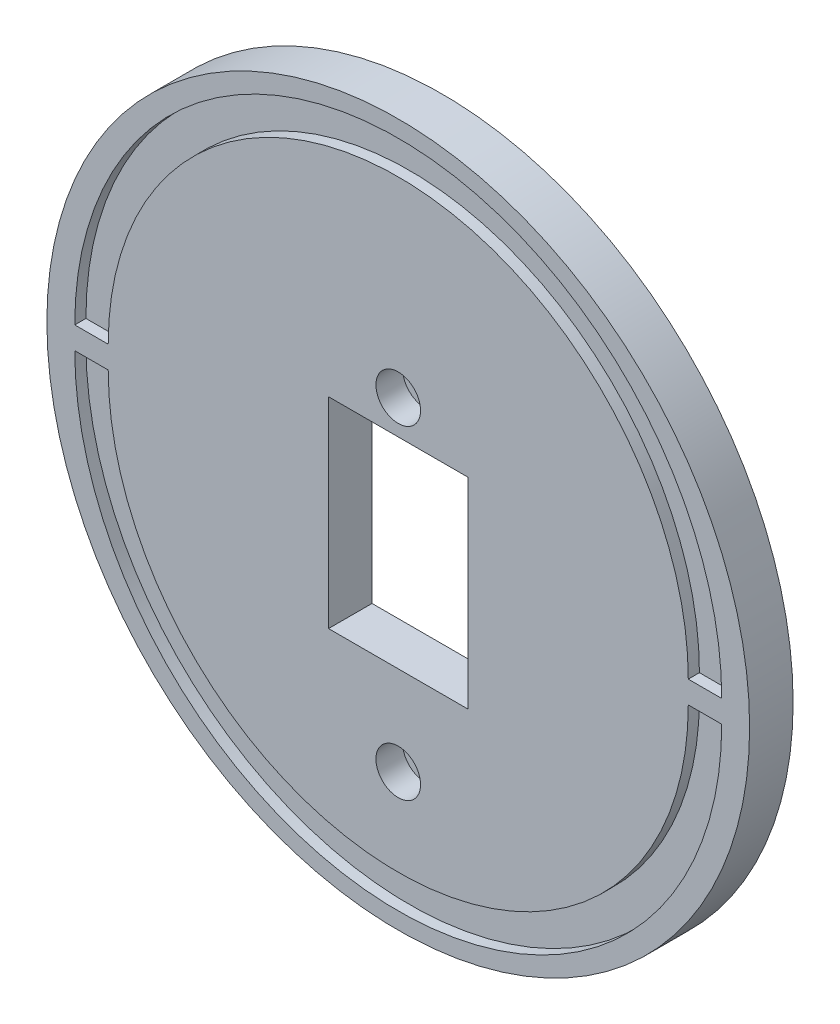
ISO-10303-21;
HEADER;
FILE_DESCRIPTION(('STEP AP214'),'2;1');
FILE_NAME('part.step','',(''),(''),'','','');
FILE_SCHEMA(('AUTOMOTIVE_DESIGN { 1 0 10303 214 1 1 1 1 }'));
ENDSEC;
DATA;
#1=APPLICATION_CONTEXT('core data for automotive mechanical design processes');
#2=APPLICATION_PROTOCOL_DEFINITION('international standard','automotive_design',2000,#1);
#3=PRODUCT_CONTEXT('',#1,'mechanical');
#4=PRODUCT('Part','Part','',(#3));
#5=PRODUCT_RELATED_PRODUCT_CATEGORY('part','',(#4));
#6=PRODUCT_DEFINITION_FORMATION('','',#4);
#7=PRODUCT_DEFINITION_CONTEXT('part definition',#1,'design');
#8=PRODUCT_DEFINITION('design','',#6,#7);
#9=PRODUCT_DEFINITION_SHAPE('','',#8);
#10=(LENGTH_UNIT() NAMED_UNIT(*) SI_UNIT(.MILLI.,.METRE.));
#11=(NAMED_UNIT(*) PLANE_ANGLE_UNIT() SI_UNIT($,.RADIAN.));
#12=(NAMED_UNIT(*) SI_UNIT($,.STERADIAN.) SOLID_ANGLE_UNIT());
#13=UNCERTAINTY_MEASURE_WITH_UNIT(LENGTH_MEASURE(1.E-05),#10,'distance_accuracy_value','');
#14=(GEOMETRIC_REPRESENTATION_CONTEXT(3) GLOBAL_UNCERTAINTY_ASSIGNED_CONTEXT((#13)) GLOBAL_UNIT_ASSIGNED_CONTEXT((#10,
#11,#12)) REPRESENTATION_CONTEXT('',''));
#15=CARTESIAN_POINT('',(0.,0.,0.));
#16=DIRECTION('',(0.,0.,1.));
#17=DIRECTION('',(1.,0.,0.));
#18=AXIS2_PLACEMENT_3D('',#15,#16,#17);
#19=CARTESIAN_POINT('',(-57.4856719225406,21.5865890189122,24.9));
#20=DIRECTION('',(1.,0.,0.));
#21=DIRECTION('',(0.,0.,-1.));
#22=AXIS2_PLACEMENT_3D('',#19,#20,#21);
#23=PLANE('',#22);
#24=DIRECTION('',(0.,0.,-1.));
#25=VECTOR('',#24,1.);
#26=CARTESIAN_POINT('',(-57.4856719225406,16.5865890189122,28.8));
#27=LINE('',#26,#25);
#28=CARTESIAN_POINT('',(-57.4856719225406,16.5865890189122,28.8));
#29=VERTEX_POINT('',#28);
#30=CARTESIAN_POINT('',(-57.4856719225406,16.5865890189122,24.9));
#31=VERTEX_POINT('',#30);
#32=EDGE_CURVE('E203',#29,#31,#27,.T.);
#33=ORIENTED_EDGE('',*,*,#32,.F.);
#34=DIRECTION('',(0.,-1.,0.));
#35=VECTOR('',#34,1.);
#36=CARTESIAN_POINT('',(-57.4856719225406,21.5865890189122,28.8));
#37=LINE('',#36,#35);
#38=CARTESIAN_POINT('',(-57.4856719225406,-1.41341098108775,28.8));
#39=VERTEX_POINT('',#38);
#40=EDGE_CURVE('E48',#29,#39,#37,.T.);
#41=ORIENTED_EDGE('',*,*,#40,.T.);
#42=DIRECTION('',(0.,0.,-1.));
#43=VECTOR('',#42,1.);
#44=CARTESIAN_POINT('',(-57.4856719225406,-1.41341098108775,28.8));
#45=LINE('',#44,#43);
#46=CARTESIAN_POINT('',(-57.4856719225406,-1.41341098108775,24.9));
#47=VERTEX_POINT('',#46);
#48=EDGE_CURVE('E209',#39,#47,#45,.T.);
#49=ORIENTED_EDGE('',*,*,#48,.T.);
#50=DIRECTION('',(0.,1.,0.));
#51=VECTOR('',#50,1.);
#52=CARTESIAN_POINT('',(-57.4856719225406,21.5865890189122,24.9));
#53=LINE('',#52,#51);
#54=EDGE_CURVE('E183',#47,#31,#53,.T.);
#55=ORIENTED_EDGE('',*,*,#54,.T.);
#56=EDGE_LOOP('',(#33,#41,#49,#55));
#57=FACE_BOUND('',#56,.T.);
#58=ADVANCED_FACE('F33',(#57),#23,.T.);
#59=CARTESIAN_POINT('',(-44.9856719225406,21.5865890189122,24.9));
#60=DIRECTION('',(-1.,0.,0.));
#61=DIRECTION('',(0.,0.,1.));
#62=AXIS2_PLACEMENT_3D('',#59,#60,#61);
#63=PLANE('',#62);
#64=DIRECTION('',(0.,0.,-1.));
#65=VECTOR('',#64,1.);
#66=CARTESIAN_POINT('',(-44.9856719225406,-1.41341098108775,28.8));
#67=LINE('',#66,#65);
#68=CARTESIAN_POINT('',(-44.9856719225406,-1.41341098108775,28.8));
#69=VERTEX_POINT('',#68);
#70=CARTESIAN_POINT('',(-44.9856719225406,-1.41341098108775,24.9));
#71=VERTEX_POINT('',#70);
#72=EDGE_CURVE('E207',#69,#71,#67,.T.);
#73=ORIENTED_EDGE('',*,*,#72,.F.);
#74=DIRECTION('',(0.,1.,0.));
#75=VECTOR('',#74,1.);
#76=CARTESIAN_POINT('',(-44.9856719225406,21.5865890189122,28.8));
#77=LINE('',#76,#75);
#78=CARTESIAN_POINT('',(-44.9856719225406,16.5865890189122,28.8));
#79=VERTEX_POINT('',#78);
#80=EDGE_CURVE('E249',#69,#79,#77,.T.);
#81=ORIENTED_EDGE('',*,*,#80,.T.);
#82=DIRECTION('',(0.,0.,-1.));
#83=VECTOR('',#82,1.);
#84=CARTESIAN_POINT('',(-44.9856719225406,16.5865890189122,28.8));
#85=LINE('',#84,#83);
#86=CARTESIAN_POINT('',(-44.9856719225406,16.5865890189122,24.9));
#87=VERTEX_POINT('',#86);
#88=EDGE_CURVE('E205',#79,#87,#85,.T.);
#89=ORIENTED_EDGE('',*,*,#88,.T.);
#90=DIRECTION('',(0.,-1.,0.));
#91=VECTOR('',#90,1.);
#92=CARTESIAN_POINT('',(-44.9856719225406,21.5865890189122,24.9));
#93=LINE('',#92,#91);
#94=EDGE_CURVE('E180',#87,#71,#93,.T.);
#95=ORIENTED_EDGE('',*,*,#94,.T.);
#96=EDGE_LOOP('',(#73,#81,#89,#95));
#97=FACE_BOUND('',#96,.T.);
#98=ADVANCED_FACE('F35',(#97),#63,.T.);
#99=CARTESIAN_POINT('',(-51.2356719225406,9.78658901891225,28.8));
#100=DIRECTION('',(0.,0.,-1.));
#101=DIRECTION('',(-1.,0.,0.));
#102=AXIS2_PLACEMENT_3D('',#99,#100,#101);
#103=CYLINDRICAL_SURFACE('',#102,31.5);
#104=CARTESIAN_POINT('',(-51.2356719225406,9.78658901891225,24.9));
#105=DIRECTION('',(0.,0.,1.));
#106=DIRECTION('',(1.,0.,0.));
#107=AXIS2_PLACEMENT_3D('',#104,#105,#106);
#108=CIRCLE('',#107,31.5);
#109=CARTESIAN_POINT('',(-19.7356719225406,9.78658901891225,24.9));
#110=VERTEX_POINT('',#109);
#111=EDGE_CURVE('E41',#110,#110,#108,.T.);
#112=ORIENTED_EDGE('',*,*,#111,.T.);
#113=EDGE_LOOP('',(#112));
#114=FACE_BOUND('',#113,.T.);
#115=CARTESIAN_POINT('',(-51.2356719225406,9.78658901891225,28.8));
#116=DIRECTION('',(0.,0.,1.));
#117=DIRECTION('',(1.,0.,0.));
#118=AXIS2_PLACEMENT_3D('',#115,#116,#117);
#119=CIRCLE('',#118,31.5);
#120=CARTESIAN_POINT('',(-19.7356719225406,9.78658901891225,28.8));
#121=VERTEX_POINT('',#120);
#122=EDGE_CURVE('E519',#121,#121,#119,.T.);
#123=ORIENTED_EDGE('',*,*,#122,.F.);
#124=EDGE_LOOP('',(#123));
#125=FACE_BOUND('',#124,.T.);
#126=ADVANCED_FACE('F286',(#114,#125),#103,.T.);
#127=CARTESIAN_POINT('',(-57.4856719225406,-1.41341098108775,28.8));
#128=DIRECTION('',(0.,1.,0.));
#129=DIRECTION('',(-1.,0.,0.));
#130=AXIS2_PLACEMENT_3D('',#127,#128,#129);
#131=PLANE('',#130);
#132=ORIENTED_EDGE('',*,*,#48,.F.);
#133=DIRECTION('',(1.,0.,0.));
#134=VECTOR('',#133,1.);
#135=CARTESIAN_POINT('',(-57.4856719225406,-1.41341098108775,28.8));
#136=LINE('',#135,#134);
#137=EDGE_CURVE('E158',#39,#69,#136,.T.);
#138=ORIENTED_EDGE('',*,*,#137,.T.);
#139=ORIENTED_EDGE('',*,*,#72,.T.);
#140=DIRECTION('',(1.,0.,0.));
#141=VECTOR('',#140,1.);
#142=CARTESIAN_POINT('',(-57.4856719225406,-1.41341098108775,24.9));
#143=LINE('',#142,#141);
#144=EDGE_CURVE('E196',#47,#71,#143,.T.);
#145=ORIENTED_EDGE('',*,*,#144,.F.);
#146=EDGE_LOOP('',(#132,#138,#139,#145));
#147=FACE_BOUND('',#146,.T.);
#148=ADVANCED_FACE('F292',(#147),#131,.T.);
#149=CARTESIAN_POINT('',(-57.4856719225406,16.5865890189122,28.8));
#150=DIRECTION('',(0.,-1.,0.));
#151=DIRECTION('',(0.,0.,-1.));
#152=AXIS2_PLACEMENT_3D('',#149,#150,#151);
#153=PLANE('',#152);
#154=ORIENTED_EDGE('',*,*,#88,.F.);
#155=DIRECTION('',(-1.,0.,0.));
#156=VECTOR('',#155,1.);
#157=CARTESIAN_POINT('',(-57.4856719225406,16.5865890189122,28.8));
#158=LINE('',#157,#156);
#159=EDGE_CURVE('E242',#79,#29,#158,.T.);
#160=ORIENTED_EDGE('',*,*,#159,.T.);
#161=ORIENTED_EDGE('',*,*,#32,.T.);
#162=DIRECTION('',(-1.,0.,0.));
#163=VECTOR('',#162,1.);
#164=CARTESIAN_POINT('',(-57.4856719225406,16.5865890189122,24.9));
#165=LINE('',#164,#163);
#166=EDGE_CURVE('E200',#87,#31,#165,.T.);
#167=ORIENTED_EDGE('',*,*,#166,.F.);
#168=EDGE_LOOP('',(#154,#160,#161,#167));
#169=FACE_BOUND('',#168,.T.);
#170=ADVANCED_FACE('F301',(#169),#153,.T.);
#171=CARTESIAN_POINT('',(-51.2356719225406,19.6365890189122,26.4));
#172=DIRECTION('',(0.,0.,1.));
#173=DIRECTION('',(1.,0.,0.));
#174=AXIS2_PLACEMENT_3D('',#171,#172,#173);
#175=CYLINDRICAL_SURFACE('',#174,2.);
#176=CARTESIAN_POINT('',(-51.2356719225406,19.6365890189122,26.4));
#177=DIRECTION('',(0.,0.,1.));
#178=DIRECTION('',(1.,0.,0.));
#179=AXIS2_PLACEMENT_3D('',#176,#177,#178);
#180=CIRCLE('',#179,2.);
#181=CARTESIAN_POINT('',(-49.2356719225406,19.6365890189122,26.4));
#182=VERTEX_POINT('',#181);
#183=EDGE_CURVE('E187',#182,#182,#180,.T.);
#184=ORIENTED_EDGE('',*,*,#183,.F.);
#185=EDGE_LOOP('',(#184));
#186=FACE_BOUND('',#185,.T.);
#187=CARTESIAN_POINT('',(-51.2356719225406,19.6365890189122,28.8));
#188=DIRECTION('',(0.,0.,1.));
#189=DIRECTION('',(1.,0.,0.));
#190=AXIS2_PLACEMENT_3D('',#187,#188,#189);
#191=CIRCLE('',#190,2.);
#192=CARTESIAN_POINT('',(-49.2356719225406,19.6365890189122,28.8));
#193=VERTEX_POINT('',#192);
#194=EDGE_CURVE('E238',#193,#193,#191,.F.);
#195=ORIENTED_EDGE('',*,*,#194,.F.);
#196=EDGE_LOOP('',(#195));
#197=FACE_BOUND('',#196,.T.);
#198=ADVANCED_FACE('F232',(#186,#197),#175,.F.);
#199=CARTESIAN_POINT('',(-51.2356719225406,-9.41341098108776,26.4));
#200=DIRECTION('',(0.,0.,1.));
#201=DIRECTION('',(1.,0.,0.));
#202=AXIS2_PLACEMENT_3D('',#199,#200,#201);
#203=CYLINDRICAL_SURFACE('',#202,2.);
#204=CARTESIAN_POINT('',(-51.2356719225406,-9.41341098108776,26.4));
#205=DIRECTION('',(0.,0.,1.));
#206=DIRECTION('',(1.,0.,0.));
#207=AXIS2_PLACEMENT_3D('',#204,#205,#206);
#208=CIRCLE('',#207,2.);
#209=CARTESIAN_POINT('',(-49.2356719225406,-9.41341098108776,26.4));
#210=VERTEX_POINT('',#209);
#211=EDGE_CURVE('E186',#210,#210,#208,.T.);
#212=ORIENTED_EDGE('',*,*,#211,.F.);
#213=EDGE_LOOP('',(#212));
#214=FACE_BOUND('',#213,.T.);
#215=CARTESIAN_POINT('',(-51.2356719225406,-9.41341098108776,28.8));
#216=DIRECTION('',(0.,0.,1.));
#217=DIRECTION('',(1.,0.,0.));
#218=AXIS2_PLACEMENT_3D('',#215,#216,#217);
#219=CIRCLE('',#218,2.);
#220=CARTESIAN_POINT('',(-49.2356719225406,-9.41341098108776,28.8));
#221=VERTEX_POINT('',#220);
#222=EDGE_CURVE('E236',#221,#221,#219,.F.);
#223=ORIENTED_EDGE('',*,*,#222,.F.);
#224=EDGE_LOOP('',(#223));
#225=FACE_BOUND('',#224,.T.);
#226=ADVANCED_FACE('F229',(#214,#225),#203,.F.);
#227=CARTESIAN_POINT('',(-51.2356719225406,-9.41341098108776,28.8));
#228=DIRECTION('',(0.,0.,-1.));
#229=DIRECTION('',(-1.,0.,0.));
#230=AXIS2_PLACEMENT_3D('',#227,#228,#229);
#231=CYLINDRICAL_SURFACE('',#230,0.999999999999998);
#232=CARTESIAN_POINT('',(-51.2356719225406,-9.41341098108776,24.9));
#233=DIRECTION('',(0.,0.,1.));
#234=DIRECTION('',(1.,0.,0.));
#235=AXIS2_PLACEMENT_3D('',#232,#233,#234);
#236=CIRCLE('',#235,0.999999999999998);
#237=CARTESIAN_POINT('',(-50.2356719225406,-9.41341098108776,24.9));
#238=VERTEX_POINT('',#237);
#239=EDGE_CURVE('E197',#238,#238,#236,.F.);
#240=ORIENTED_EDGE('',*,*,#239,.T.);
#241=EDGE_LOOP('',(#240));
#242=FACE_BOUND('',#241,.T.);
#243=CARTESIAN_POINT('',(-51.2356719225406,-9.41341098108776,26.4));
#244=DIRECTION('',(0.,0.,1.));
#245=DIRECTION('',(1.,0.,0.));
#246=AXIS2_PLACEMENT_3D('',#243,#244,#245);
#247=CIRCLE('',#246,0.999999999999998);
#248=CARTESIAN_POINT('',(-50.2356719225406,-9.41341098108776,26.4));
#249=VERTEX_POINT('',#248);
#250=EDGE_CURVE('E215',#249,#249,#247,.T.);
#251=ORIENTED_EDGE('',*,*,#250,.T.);
#252=EDGE_LOOP('',(#251));
#253=FACE_BOUND('',#252,.T.);
#254=ADVANCED_FACE('F220',(#242,#253),#231,.F.);
#255=CARTESIAN_POINT('',(-51.2356719225406,19.6365890189122,28.8));
#256=DIRECTION('',(0.,0.,-1.));
#257=DIRECTION('',(-1.,0.,0.));
#258=AXIS2_PLACEMENT_3D('',#255,#256,#257);
#259=CYLINDRICAL_SURFACE('',#258,0.999999999999998);
#260=CARTESIAN_POINT('',(-51.2356719225406,19.6365890189122,24.9));
#261=DIRECTION('',(0.,0.,1.));
#262=DIRECTION('',(1.,0.,0.));
#263=AXIS2_PLACEMENT_3D('',#260,#261,#262);
#264=CIRCLE('',#263,0.999999999999998);
#265=CARTESIAN_POINT('',(-50.2356719225406,19.6365890189122,24.9));
#266=VERTEX_POINT('',#265);
#267=EDGE_CURVE('E193',#266,#266,#264,.F.);
#268=ORIENTED_EDGE('',*,*,#267,.T.);
#269=EDGE_LOOP('',(#268));
#270=FACE_BOUND('',#269,.T.);
#271=CARTESIAN_POINT('',(-51.2356719225406,19.6365890189122,26.4));
#272=DIRECTION('',(0.,0.,1.));
#273=DIRECTION('',(1.,0.,0.));
#274=AXIS2_PLACEMENT_3D('',#271,#272,#273);
#275=CIRCLE('',#274,0.999999999999998);
#276=CARTESIAN_POINT('',(-50.2356719225406,19.6365890189122,26.4));
#277=VERTEX_POINT('',#276);
#278=EDGE_CURVE('E190',#277,#277,#275,.T.);
#279=ORIENTED_EDGE('',*,*,#278,.T.);
#280=EDGE_LOOP('',(#279));
#281=FACE_BOUND('',#280,.T.);
#282=ADVANCED_FACE('F297',(#270,#281),#259,.F.);
#283=CARTESIAN_POINT('',(-51.2356719225406,9.78658901891225,24.9));
#284=DIRECTION('',(0.,0.,1.));
#285=DIRECTION('',(1.,0.,0.));
#286=AXIS2_PLACEMENT_3D('',#283,#284,#285);
#287=PLANE('',#286);
#288=ORIENTED_EDGE('',*,*,#166,.T.);
#289=ORIENTED_EDGE('',*,*,#54,.F.);
#290=ORIENTED_EDGE('',*,*,#144,.T.);
#291=ORIENTED_EDGE('',*,*,#94,.F.);
#292=EDGE_LOOP('',(#288,#289,#290,#291));
#293=FACE_BOUND('',#292,.T.);
#294=ORIENTED_EDGE('',*,*,#111,.F.);
#295=EDGE_LOOP('',(#294));
#296=FACE_BOUND('',#295,.T.);
#297=ORIENTED_EDGE('',*,*,#267,.F.);
#298=EDGE_LOOP('',(#297));
#299=FACE_BOUND('',#298,.T.);
#300=ORIENTED_EDGE('',*,*,#239,.F.);
#301=EDGE_LOOP('',(#300));
#302=FACE_BOUND('',#301,.T.);
#303=ADVANCED_FACE('F294',(#293,#296,#299,#302),#287,.F.);
#304=CARTESIAN_POINT('',(-51.2356719225406,19.6365890189122,26.4));
#305=DIRECTION('',(0.,0.,1.));
#306=DIRECTION('',(1.,0.,0.));
#307=AXIS2_PLACEMENT_3D('',#304,#305,#306);
#308=PLANE('',#307);
#309=ORIENTED_EDGE('',*,*,#278,.F.);
#310=EDGE_LOOP('',(#309));
#311=FACE_BOUND('',#310,.T.);
#312=ORIENTED_EDGE('',*,*,#183,.T.);
#313=EDGE_LOOP('',(#312));
#314=FACE_BOUND('',#313,.T.);
#315=ADVANCED_FACE('F225',(#311,#314),#308,.T.);
#316=CARTESIAN_POINT('',(-51.2356719225406,-9.41341098108776,26.4));
#317=DIRECTION('',(0.,0.,1.));
#318=DIRECTION('',(1.,0.,0.));
#319=AXIS2_PLACEMENT_3D('',#316,#317,#318);
#320=PLANE('',#319);
#321=ORIENTED_EDGE('',*,*,#250,.F.);
#322=EDGE_LOOP('',(#321));
#323=FACE_BOUND('',#322,.T.);
#324=ORIENTED_EDGE('',*,*,#211,.T.);
#325=EDGE_LOOP('',(#324));
#326=FACE_BOUND('',#325,.T.);
#327=ADVANCED_FACE('F222',(#323,#326),#320,.T.);
#328=CARTESIAN_POINT('',(-51.2356719225406,9.78658901891225,28.8));
#329=DIRECTION('',(0.,0.,1.));
#330=DIRECTION('',(1.,0.,0.));
#331=AXIS2_PLACEMENT_3D('',#328,#329,#330);
#332=PLANE('',#331);
#333=ORIENTED_EDGE('',*,*,#40,.F.);
#334=ORIENTED_EDGE('',*,*,#159,.F.);
#335=ORIENTED_EDGE('',*,*,#80,.F.);
#336=ORIENTED_EDGE('',*,*,#137,.F.);
#337=EDGE_LOOP('',(#333,#334,#335,#336));
#338=FACE_BOUND('',#337,.T.);
#339=CARTESIAN_POINT('',(-51.2356719225406,8.78658901891225,28.8));
#340=DIRECTION('',(0.,0.,1.));
#341=DIRECTION('',(1.,0.,0.));
#342=AXIS2_PLACEMENT_3D('',#339,#340,#341);
#343=CIRCLE('',#342,29.);
#344=CARTESIAN_POINT('',(-22.2356719225406,8.78658901891225,28.8));
#345=VERTEX_POINT('',#344);
#346=CARTESIAN_POINT('',(-80.2356719225406,8.78658901891225,28.8));
#347=VERTEX_POINT('',#346);
#348=EDGE_CURVE('E123',#345,#347,#343,.F.);
#349=ORIENTED_EDGE('',*,*,#348,.T.);
#350=DIRECTION('',(1.,0.,0.));
#351=VECTOR('',#350,1.);
#352=CARTESIAN_POINT('',(-80.2356719225406,8.78658901891225,28.8));
#353=LINE('',#352,#351);
#354=CARTESIAN_POINT('',(-77.2356719225406,8.78658901891224,28.8));
#355=VERTEX_POINT('',#354);
#356=EDGE_CURVE('E138',#347,#355,#353,.T.);
#357=ORIENTED_EDGE('',*,*,#356,.T.);
#358=CARTESIAN_POINT('',(-51.2356719225406,8.78658901891224,28.8));
#359=DIRECTION('',(0.,0.,1.));
#360=DIRECTION('',(1.,0.,0.));
#361=AXIS2_PLACEMENT_3D('',#358,#359,#360);
#362=CIRCLE('',#361,26.);
#363=CARTESIAN_POINT('',(-25.2356719225406,8.78658901891225,28.8));
#364=VERTEX_POINT('',#363);
#365=EDGE_CURVE('E126',#355,#364,#362,.T.);
#366=ORIENTED_EDGE('',*,*,#365,.T.);
#367=DIRECTION('',(1.,0.,0.));
#368=VECTOR('',#367,1.);
#369=CARTESIAN_POINT('',(-22.2356719225406,8.78658901891225,28.8));
#370=LINE('',#369,#368);
#371=EDGE_CURVE('E11',#364,#345,#370,.T.);
#372=ORIENTED_EDGE('',*,*,#371,.T.);
#373=EDGE_LOOP('',(#349,#357,#366,#372));
#374=FACE_BOUND('',#373,.T.);
#375=ORIENTED_EDGE('',*,*,#122,.T.);
#376=EDGE_LOOP('',(#375));
#377=FACE_BOUND('',#376,.T.);
#378=CARTESIAN_POINT('',(-51.2356719225406,10.7865890189122,28.8));
#379=DIRECTION('',(0.,0.,1.));
#380=DIRECTION('',(1.,0.,0.));
#381=AXIS2_PLACEMENT_3D('',#378,#379,#380);
#382=CIRCLE('',#381,29.);
#383=CARTESIAN_POINT('',(-80.2356719225406,10.7865890189122,28.8));
#384=VERTEX_POINT('',#383);
#385=CARTESIAN_POINT('',(-22.2356719225406,10.7865890189122,28.8));
#386=VERTEX_POINT('',#385);
#387=EDGE_CURVE('E239',#384,#386,#382,.F.);
#388=ORIENTED_EDGE('',*,*,#387,.T.);
#389=DIRECTION('',(-1.,0.,0.));
#390=VECTOR('',#389,1.);
#391=CARTESIAN_POINT('',(-22.2356719225406,10.7865890189122,28.8));
#392=LINE('',#391,#390);
#393=CARTESIAN_POINT('',(-25.2356719225406,10.7865890189122,28.8));
#394=VERTEX_POINT('',#393);
#395=EDGE_CURVE('E244',#386,#394,#392,.T.);
#396=ORIENTED_EDGE('',*,*,#395,.T.);
#397=CARTESIAN_POINT('',(-51.2356719225406,10.7865890189122,28.8));
#398=DIRECTION('',(0.,0.,1.));
#399=DIRECTION('',(1.,0.,0.));
#400=AXIS2_PLACEMENT_3D('',#397,#398,#399);
#401=CIRCLE('',#400,26.);
#402=CARTESIAN_POINT('',(-77.2356719225406,10.7865890189122,28.8));
#403=VERTEX_POINT('',#402);
#404=EDGE_CURVE('E56',#394,#403,#401,.T.);
#405=ORIENTED_EDGE('',*,*,#404,.T.);
#406=DIRECTION('',(-1.,0.,0.));
#407=VECTOR('',#406,1.);
#408=CARTESIAN_POINT('',(-80.2356719225406,10.7865890189122,28.8));
#409=LINE('',#408,#407);
#410=EDGE_CURVE('E137',#403,#384,#409,.T.);
#411=ORIENTED_EDGE('',*,*,#410,.T.);
#412=EDGE_LOOP('',(#388,#396,#405,#411));
#413=FACE_BOUND('',#412,.T.);
#414=ORIENTED_EDGE('',*,*,#222,.T.);
#415=EDGE_LOOP('',(#414));
#416=FACE_BOUND('',#415,.T.);
#417=ORIENTED_EDGE('',*,*,#194,.T.);
#418=EDGE_LOOP('',(#417));
#419=FACE_BOUND('',#418,.T.);
#420=ADVANCED_FACE('F121',(#338,#374,#377,#413,#416,#419),#332,.T.);
#421=CARTESIAN_POINT('',(-51.2356719225406,10.7865890189122,27.8));
#422=DIRECTION('',(0.,0.,1.));
#423=DIRECTION('',(1.,0.,0.));
#424=AXIS2_PLACEMENT_3D('',#421,#422,#423);
#425=PLANE('',#424);
#426=CARTESIAN_POINT('',(-51.2356719225406,10.7865890189122,27.8));
#427=DIRECTION('',(0.,0.,1.));
#428=DIRECTION('',(1.,0.,0.));
#429=AXIS2_PLACEMENT_3D('',#426,#427,#428);
#430=CIRCLE('',#429,29.);
#431=CARTESIAN_POINT('',(-22.2356719225406,10.7865890189122,27.8));
#432=VERTEX_POINT('',#431);
#433=CARTESIAN_POINT('',(-80.2356719225406,10.7865890189122,27.8));
#434=VERTEX_POINT('',#433);
#435=EDGE_CURVE('E154',#432,#434,#430,.T.);
#436=ORIENTED_EDGE('',*,*,#435,.T.);
#437=DIRECTION('',(1.,0.,0.));
#438=VECTOR('',#437,1.);
#439=CARTESIAN_POINT('',(-80.2356719225406,10.7865890189122,27.8));
#440=LINE('',#439,#438);
#441=CARTESIAN_POINT('',(-77.2356719225406,10.7865890189122,27.8));
#442=VERTEX_POINT('',#441);
#443=EDGE_CURVE('E157',#434,#442,#440,.T.);
#444=ORIENTED_EDGE('',*,*,#443,.T.);
#445=CARTESIAN_POINT('',(-51.2356719225406,10.7865890189122,27.8));
#446=DIRECTION('',(0.,0.,-1.));
#447=DIRECTION('',(1.,0.,0.));
#448=AXIS2_PLACEMENT_3D('',#445,#446,#447);
#449=CIRCLE('',#448,26.);
#450=CARTESIAN_POINT('',(-25.2356719225406,10.7865890189122,27.8));
#451=VERTEX_POINT('',#450);
#452=EDGE_CURVE('E161',#442,#451,#449,.T.);
#453=ORIENTED_EDGE('',*,*,#452,.T.);
#454=DIRECTION('',(1.,0.,0.));
#455=VECTOR('',#454,1.);
#456=CARTESIAN_POINT('',(-22.2356719225406,10.7865890189122,27.8));
#457=LINE('',#456,#455);
#458=EDGE_CURVE('E164',#451,#432,#457,.T.);
#459=ORIENTED_EDGE('',*,*,#458,.T.);
#460=EDGE_LOOP('',(#436,#444,#453,#459));
#461=FACE_BOUND('',#460,.T.);
#462=ADVANCED_FACE('F322',(#461),#425,.T.);
#463=CARTESIAN_POINT('',(-80.2356719225406,10.7865890189122,27.8));
#464=DIRECTION('',(0.,-1.,0.));
#465=DIRECTION('',(1.,0.,0.));
#466=AXIS2_PLACEMENT_3D('',#463,#464,#465);
#467=PLANE('',#466);
#468=ORIENTED_EDGE('',*,*,#410,.F.);
#469=DIRECTION('',(0.,0.,1.));
#470=VECTOR('',#469,1.);
#471=CARTESIAN_POINT('',(-77.2356719225406,10.7865890189122,27.8));
#472=LINE('',#471,#470);
#473=EDGE_CURVE('E175',#442,#403,#472,.T.);
#474=ORIENTED_EDGE('',*,*,#473,.F.);
#475=ORIENTED_EDGE('',*,*,#443,.F.);
#476=DIRECTION('',(0.,0.,1.));
#477=VECTOR('',#476,1.);
#478=CARTESIAN_POINT('',(-80.2356719225406,10.7865890189122,27.8));
#479=LINE('',#478,#477);
#480=EDGE_CURVE('E167',#434,#384,#479,.T.);
#481=ORIENTED_EDGE('',*,*,#480,.T.);
#482=EDGE_LOOP('',(#468,#474,#475,#481));
#483=FACE_BOUND('',#482,.T.);
#484=ADVANCED_FACE('F318',(#483),#467,.F.);
#485=CARTESIAN_POINT('',(-51.2356719225406,10.7865890189122,27.8));
#486=DIRECTION('',(0.,0.,1.));
#487=DIRECTION('',(1.,0.,0.));
#488=AXIS2_PLACEMENT_3D('',#485,#486,#487);
#489=CYLINDRICAL_SURFACE('',#488,26.);
#490=ORIENTED_EDGE('',*,*,#404,.F.);
#491=DIRECTION('',(0.,0.,1.));
#492=VECTOR('',#491,1.);
#493=CARTESIAN_POINT('',(-25.2356719225406,10.7865890189122,27.8));
#494=LINE('',#493,#492);
#495=EDGE_CURVE('E172',#451,#394,#494,.T.);
#496=ORIENTED_EDGE('',*,*,#495,.F.);
#497=ORIENTED_EDGE('',*,*,#452,.F.);
#498=ORIENTED_EDGE('',*,*,#473,.T.);
#499=EDGE_LOOP('',(#490,#496,#497,#498));
#500=FACE_BOUND('',#499,.T.);
#501=ADVANCED_FACE('F321',(#500),#489,.T.);
#502=CARTESIAN_POINT('',(-22.2356719225406,10.7865890189122,27.8));
#503=DIRECTION('',(0.,-1.,0.));
#504=DIRECTION('',(1.,0.,0.));
#505=AXIS2_PLACEMENT_3D('',#502,#503,#504);
#506=PLANE('',#505);
#507=ORIENTED_EDGE('',*,*,#395,.F.);
#508=DIRECTION('',(0.,0.,1.));
#509=VECTOR('',#508,1.);
#510=CARTESIAN_POINT('',(-22.2356719225406,10.7865890189122,27.8));
#511=LINE('',#510,#509);
#512=EDGE_CURVE('E168',#432,#386,#511,.T.);
#513=ORIENTED_EDGE('',*,*,#512,.F.);
#514=ORIENTED_EDGE('',*,*,#458,.F.);
#515=ORIENTED_EDGE('',*,*,#495,.T.);
#516=EDGE_LOOP('',(#507,#513,#514,#515));
#517=FACE_BOUND('',#516,.T.);
#518=ADVANCED_FACE('F276',(#517),#506,.F.);
#519=CARTESIAN_POINT('',(-51.2356719225406,10.7865890189122,27.8));
#520=DIRECTION('',(0.,0.,1.));
#521=DIRECTION('',(1.,0.,0.));
#522=AXIS2_PLACEMENT_3D('',#519,#520,#521);
#523=CYLINDRICAL_SURFACE('',#522,29.);
#524=ORIENTED_EDGE('',*,*,#387,.F.);
#525=ORIENTED_EDGE('',*,*,#480,.F.);
#526=ORIENTED_EDGE('',*,*,#435,.F.);
#527=ORIENTED_EDGE('',*,*,#512,.T.);
#528=EDGE_LOOP('',(#524,#525,#526,#527));
#529=FACE_BOUND('',#528,.T.);
#530=ADVANCED_FACE('F269',(#529),#523,.F.);
#531=CARTESIAN_POINT('',(-51.2356719225406,8.78658901891225,27.8));
#532=DIRECTION('',(0.,0.,-1.));
#533=DIRECTION('',(-1.,0.,0.));
#534=AXIS2_PLACEMENT_3D('',#531,#532,#533);
#535=PLANE('',#534);
#536=CARTESIAN_POINT('',(-51.2356719225406,8.78658901891225,27.8));
#537=DIRECTION('',(0.,0.,1.));
#538=DIRECTION('',(-1.,0.,0.));
#539=AXIS2_PLACEMENT_3D('',#536,#537,#538);
#540=CIRCLE('',#539,29.);
#541=CARTESIAN_POINT('',(-80.2356719225406,8.78658901891225,27.8));
#542=VERTEX_POINT('',#541);
#543=CARTESIAN_POINT('',(-22.2356719225406,8.78658901891225,27.8));
#544=VERTEX_POINT('',#543);
#545=EDGE_CURVE('E171',#542,#544,#540,.T.);
#546=ORIENTED_EDGE('',*,*,#545,.T.);
#547=DIRECTION('',(-1.,0.,0.));
#548=VECTOR('',#547,1.);
#549=CARTESIAN_POINT('',(-22.2356719225406,8.78658901891225,27.8));
#550=LINE('',#549,#548);
#551=CARTESIAN_POINT('',(-25.2356719225406,8.78658901891225,27.8));
#552=VERTEX_POINT('',#551);
#553=EDGE_CURVE('E142',#544,#552,#550,.T.);
#554=ORIENTED_EDGE('',*,*,#553,.T.);
#555=CARTESIAN_POINT('',(-51.2356719225406,8.78658901891224,27.8));
#556=DIRECTION('',(0.,0.,-1.));
#557=DIRECTION('',(-1.,0.,0.));
#558=AXIS2_PLACEMENT_3D('',#555,#556,#557);
#559=CIRCLE('',#558,26.);
#560=CARTESIAN_POINT('',(-77.2356719225406,8.78658901891224,27.8));
#561=VERTEX_POINT('',#560);
#562=EDGE_CURVE('E150',#552,#561,#559,.T.);
#563=ORIENTED_EDGE('',*,*,#562,.T.);
#564=DIRECTION('',(-1.,0.,0.));
#565=VECTOR('',#564,1.);
#566=CARTESIAN_POINT('',(-80.2356719225406,8.78658901891225,27.8));
#567=LINE('',#566,#565);
#568=EDGE_CURVE('E145',#561,#542,#567,.T.);
#569=ORIENTED_EDGE('',*,*,#568,.T.);
#570=EDGE_LOOP('',(#546,#554,#563,#569));
#571=FACE_BOUND('',#570,.T.);
#572=ADVANCED_FACE('F267',(#571),#535,.F.);
#573=CARTESIAN_POINT('',(-22.2356719225406,8.78658901891225,27.8));
#574=DIRECTION('',(0.,1.,0.));
#575=DIRECTION('',(-1.,0.,0.));
#576=AXIS2_PLACEMENT_3D('',#573,#574,#575);
#577=PLANE('',#576);
#578=ORIENTED_EDGE('',*,*,#371,.F.);
#579=DIRECTION('',(0.,0.,1.));
#580=VECTOR('',#579,1.);
#581=CARTESIAN_POINT('',(-25.2356719225406,8.78658901891225,27.8));
#582=LINE('',#581,#580);
#583=EDGE_CURVE('E144',#552,#364,#582,.T.);
#584=ORIENTED_EDGE('',*,*,#583,.F.);
#585=ORIENTED_EDGE('',*,*,#553,.F.);
#586=DIRECTION('',(0.,0.,1.));
#587=VECTOR('',#586,1.);
#588=CARTESIAN_POINT('',(-22.2356719225406,8.78658901891225,27.8));
#589=LINE('',#588,#587);
#590=EDGE_CURVE('E134',#544,#345,#589,.T.);
#591=ORIENTED_EDGE('',*,*,#590,.T.);
#592=EDGE_LOOP('',(#578,#584,#585,#591));
#593=FACE_BOUND('',#592,.T.);
#594=ADVANCED_FACE('F140',(#593),#577,.F.);
#595=CARTESIAN_POINT('',(-51.2356719225406,8.78658901891224,27.8));
#596=DIRECTION('',(0.,0.,1.));
#597=DIRECTION('',(1.,0.,0.));
#598=AXIS2_PLACEMENT_3D('',#595,#596,#597);
#599=CYLINDRICAL_SURFACE('',#598,26.);
#600=ORIENTED_EDGE('',*,*,#365,.F.);
#601=DIRECTION('',(0.,0.,1.));
#602=VECTOR('',#601,1.);
#603=CARTESIAN_POINT('',(-77.2356719225406,8.78658901891224,27.8));
#604=LINE('',#603,#602);
#605=EDGE_CURVE('E147',#561,#355,#604,.T.);
#606=ORIENTED_EDGE('',*,*,#605,.F.);
#607=ORIENTED_EDGE('',*,*,#562,.F.);
#608=ORIENTED_EDGE('',*,*,#583,.T.);
#609=EDGE_LOOP('',(#600,#606,#607,#608));
#610=FACE_BOUND('',#609,.T.);
#611=ADVANCED_FACE('F265',(#610),#599,.T.);
#612=CARTESIAN_POINT('',(-80.2356719225406,8.78658901891225,27.8));
#613=DIRECTION('',(0.,1.,0.));
#614=DIRECTION('',(-1.,0.,0.));
#615=AXIS2_PLACEMENT_3D('',#612,#613,#614);
#616=PLANE('',#615);
#617=ORIENTED_EDGE('',*,*,#356,.F.);
#618=DIRECTION('',(0.,0.,1.));
#619=VECTOR('',#618,1.);
#620=CARTESIAN_POINT('',(-80.2356719225406,8.78658901891225,27.8));
#621=LINE('',#620,#619);
#622=EDGE_CURVE('E136',#542,#347,#621,.T.);
#623=ORIENTED_EDGE('',*,*,#622,.F.);
#624=ORIENTED_EDGE('',*,*,#568,.F.);
#625=ORIENTED_EDGE('',*,*,#605,.T.);
#626=EDGE_LOOP('',(#617,#623,#624,#625));
#627=FACE_BOUND('',#626,.T.);
#628=ADVANCED_FACE('F262',(#627),#616,.F.);
#629=CARTESIAN_POINT('',(-51.2356719225406,8.78658901891225,27.8));
#630=DIRECTION('',(0.,0.,1.));
#631=DIRECTION('',(1.,0.,0.));
#632=AXIS2_PLACEMENT_3D('',#629,#630,#631);
#633=CYLINDRICAL_SURFACE('',#632,29.);
#634=ORIENTED_EDGE('',*,*,#348,.F.);
#635=ORIENTED_EDGE('',*,*,#590,.F.);
#636=ORIENTED_EDGE('',*,*,#545,.F.);
#637=ORIENTED_EDGE('',*,*,#622,.T.);
#638=EDGE_LOOP('',(#634,#635,#636,#637));
#639=FACE_BOUND('',#638,.T.);
#640=ADVANCED_FACE('F132',(#639),#633,.F.);
#641=CLOSED_SHELL('',(#58,#98,#126,#148,#170,#198,#226,#254,#282,#303,#315,#327,#420,#462,#484,
#501,#518,#530,#572,#594,#611,#628,#640));
#642=MANIFOLD_SOLID_BREP('B2',#641);
#643=ADVANCED_BREP_SHAPE_REPRESENTATION('',(#18,#642),#14);
#644=SHAPE_DEFINITION_REPRESENTATION(#9,#643);
ENDSEC;
END-ISO-10303-21;
